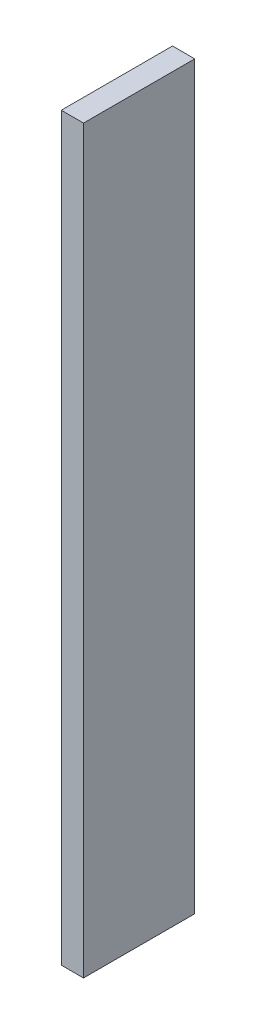
ISO-10303-21;
HEADER;
FILE_DESCRIPTION(('STEP AP214'),'2;1');
FILE_NAME('part.step','',(''),(''),'','','');
FILE_SCHEMA(('AUTOMOTIVE_DESIGN { 1 0 10303 214 1 1 1 1 }'));
ENDSEC;
DATA;
#1=APPLICATION_CONTEXT('core data for automotive mechanical design processes');
#2=APPLICATION_PROTOCOL_DEFINITION('international standard','automotive_design',2000,#1);
#3=PRODUCT_CONTEXT('',#1,'mechanical');
#4=PRODUCT('Part','Part','',(#3));
#5=PRODUCT_RELATED_PRODUCT_CATEGORY('part','',(#4));
#6=PRODUCT_DEFINITION_FORMATION('','',#4);
#7=PRODUCT_DEFINITION_CONTEXT('part definition',#1,'design');
#8=PRODUCT_DEFINITION('design','',#6,#7);
#9=PRODUCT_DEFINITION_SHAPE('','',#8);
#10=(LENGTH_UNIT() NAMED_UNIT(*) SI_UNIT(.MILLI.,.METRE.));
#11=(NAMED_UNIT(*) PLANE_ANGLE_UNIT() SI_UNIT($,.RADIAN.));
#12=(NAMED_UNIT(*) SI_UNIT($,.STERADIAN.) SOLID_ANGLE_UNIT());
#13=UNCERTAINTY_MEASURE_WITH_UNIT(LENGTH_MEASURE(1.E-05),#10,'distance_accuracy_value','');
#14=(GEOMETRIC_REPRESENTATION_CONTEXT(3) GLOBAL_UNCERTAINTY_ASSIGNED_CONTEXT((#13)) GLOBAL_UNIT_ASSIGNED_CONTEXT((#10,
#11,#12)) REPRESENTATION_CONTEXT('',''));
#15=CARTESIAN_POINT('',(0.,0.,0.));
#16=DIRECTION('',(0.,0.,1.));
#17=DIRECTION('',(1.,0.,0.));
#18=AXIS2_PLACEMENT_3D('',#15,#16,#17);
#19=CARTESIAN_POINT('',(68.4980932156586,185.939608660786,0.));
#20=DIRECTION('',(0.,0.,-1.));
#21=DIRECTION('',(1.,0.,0.));
#22=AXIS2_PLACEMENT_3D('',#19,#20,#21);
#23=PLANE('',#22);
#24=DIRECTION('',(0.,1.,0.));
#25=VECTOR('',#24,1.);
#26=CARTESIAN_POINT('',(-41.5019067843414,185.939608660786,0.));
#27=LINE('',#26,#25);
#28=CARTESIAN_POINT('',(-41.5019067843413,-66.8479872866524,0.));
#29=VERTEX_POINT('',#28);
#30=CARTESIAN_POINT('',(-41.5019067843414,265.939608660786,0.));
#31=VERTEX_POINT('',#30);
#32=EDGE_CURVE('E74',#29,#31,#27,.T.);
#33=ORIENTED_EDGE('',*,*,#32,.F.);
#34=DIRECTION('',(-1.,0.,0.));
#35=VECTOR('',#34,1.);
#36=CARTESIAN_POINT('',(-41.5019067843413,-66.8479872866524,0.));
#37=LINE('',#36,#35);
#38=CARTESIAN_POINT('',(-51.5019067843414,-66.8479872866524,0.));
#39=VERTEX_POINT('',#38);
#40=EDGE_CURVE('E99',#29,#39,#37,.T.);
#41=ORIENTED_EDGE('',*,*,#40,.T.);
#42=DIRECTION('',(0.,1.,0.));
#43=VECTOR('',#42,1.);
#44=CARTESIAN_POINT('',(-51.5019067843414,185.939608660786,0.));
#45=LINE('',#44,#43);
#46=CARTESIAN_POINT('',(-51.5019067843414,265.939608660786,0.));
#47=VERTEX_POINT('',#46);
#48=EDGE_CURVE('E92',#39,#47,#45,.T.);
#49=ORIENTED_EDGE('',*,*,#48,.T.);
#50=DIRECTION('',(1.,0.,0.));
#51=VECTOR('',#50,1.);
#52=CARTESIAN_POINT('',(-51.5019067843414,265.939608660786,0.));
#53=LINE('',#52,#51);
#54=EDGE_CURVE('E113',#47,#31,#53,.T.);
#55=ORIENTED_EDGE('',*,*,#54,.T.);
#56=EDGE_LOOP('',(#33,#41,#49,#55));
#57=FACE_BOUND('',#56,.T.);
#58=ADVANCED_FACE('F43',(#57),#23,.T.);
#59=CARTESIAN_POINT('',(-41.5019067843414,185.939608660786,50.));
#60=DIRECTION('',(-1.,0.,0.));
#61=DIRECTION('',(0.,-1.,0.));
#62=AXIS2_PLACEMENT_3D('',#59,#60,#61);
#63=PLANE('',#62);
#64=ORIENTED_EDGE('',*,*,#32,.T.);
#65=DIRECTION('',(0.,0.,-1.));
#66=VECTOR('',#65,1.);
#67=CARTESIAN_POINT('',(-41.5019067843414,265.939608660786,50.));
#68=LINE('',#67,#66);
#69=CARTESIAN_POINT('',(-41.5019067843414,265.939608660786,50.));
#70=VERTEX_POINT('',#69);
#71=EDGE_CURVE('E12',#70,#31,#68,.T.);
#72=ORIENTED_EDGE('',*,*,#71,.F.);
#73=DIRECTION('',(0.,1.,0.));
#74=VECTOR('',#73,1.);
#75=CARTESIAN_POINT('',(-41.5019067843414,185.939608660786,50.));
#76=LINE('',#75,#74);
#77=CARTESIAN_POINT('',(-41.5019067843413,-66.8479872866524,50.));
#78=VERTEX_POINT('',#77);
#79=EDGE_CURVE('E84',#78,#70,#76,.T.);
#80=ORIENTED_EDGE('',*,*,#79,.F.);
#81=DIRECTION('',(0.,0.,-1.));
#82=VECTOR('',#81,1.);
#83=CARTESIAN_POINT('',(-41.5019067843413,-66.8479872866524,50.));
#84=LINE('',#83,#82);
#85=EDGE_CURVE('E87',#78,#29,#84,.T.);
#86=ORIENTED_EDGE('',*,*,#85,.T.);
#87=EDGE_LOOP('',(#64,#72,#80,#86));
#88=FACE_BOUND('',#87,.T.);
#89=ADVANCED_FACE('F86',(#88),#63,.F.);
#90=CARTESIAN_POINT('',(-51.5019067843414,265.939608660786,50.));
#91=DIRECTION('',(0.,1.,0.));
#92=DIRECTION('',(0.,0.,-1.));
#93=AXIS2_PLACEMENT_3D('',#90,#91,#92);
#94=PLANE('',#93);
#95=ORIENTED_EDGE('',*,*,#54,.F.);
#96=DIRECTION('',(0.,0.,-1.));
#97=VECTOR('',#96,1.);
#98=CARTESIAN_POINT('',(-51.5019067843414,265.939608660786,50.));
#99=LINE('',#98,#97);
#100=CARTESIAN_POINT('',(-51.5019067843414,265.939608660786,50.));
#101=VERTEX_POINT('',#100);
#102=EDGE_CURVE('E52',#101,#47,#99,.T.);
#103=ORIENTED_EDGE('',*,*,#102,.F.);
#104=DIRECTION('',(1.,0.,0.));
#105=VECTOR('',#104,1.);
#106=CARTESIAN_POINT('',(-51.5019067843414,265.939608660786,50.));
#107=LINE('',#106,#105);
#108=EDGE_CURVE('E91',#101,#70,#107,.T.);
#109=ORIENTED_EDGE('',*,*,#108,.T.);
#110=ORIENTED_EDGE('',*,*,#71,.T.);
#111=EDGE_LOOP('',(#95,#103,#109,#110));
#112=FACE_BOUND('',#111,.T.);
#113=ADVANCED_FACE('F117',(#112),#94,.T.);
#114=CARTESIAN_POINT('',(-51.5019067843414,-66.8479872866524,50.));
#115=DIRECTION('',(-1.,0.,0.));
#116=DIRECTION('',(0.,0.,1.));
#117=AXIS2_PLACEMENT_3D('',#114,#115,#116);
#118=PLANE('',#117);
#119=ORIENTED_EDGE('',*,*,#48,.F.);
#120=DIRECTION('',(0.,0.,-1.));
#121=VECTOR('',#120,1.);
#122=CARTESIAN_POINT('',(-51.5019067843414,-66.8479872866524,50.));
#123=LINE('',#122,#121);
#124=CARTESIAN_POINT('',(-51.5019067843414,-66.8479872866524,50.));
#125=VERTEX_POINT('',#124);
#126=EDGE_CURVE('E105',#125,#39,#123,.T.);
#127=ORIENTED_EDGE('',*,*,#126,.F.);
#128=DIRECTION('',(0.,1.,0.));
#129=VECTOR('',#128,1.);
#130=CARTESIAN_POINT('',(-51.5019067843414,185.939608660786,50.));
#131=LINE('',#130,#129);
#132=EDGE_CURVE('E103',#125,#101,#131,.T.);
#133=ORIENTED_EDGE('',*,*,#132,.T.);
#134=ORIENTED_EDGE('',*,*,#102,.T.);
#135=EDGE_LOOP('',(#119,#127,#133,#134));
#136=FACE_BOUND('',#135,.T.);
#137=ADVANCED_FACE('F45',(#136),#118,.T.);
#138=CARTESIAN_POINT('',(8.49809321565865,185.939608660786,50.));
#139=DIRECTION('',(0.,0.,1.));
#140=DIRECTION('',(-1.,0.,0.));
#141=AXIS2_PLACEMENT_3D('',#138,#139,#140);
#142=PLANE('',#141);
#143=ORIENTED_EDGE('',*,*,#79,.T.);
#144=ORIENTED_EDGE('',*,*,#108,.F.);
#145=ORIENTED_EDGE('',*,*,#132,.F.);
#146=DIRECTION('',(-1.,0.,0.));
#147=VECTOR('',#146,1.);
#148=CARTESIAN_POINT('',(-41.5019067843413,-66.8479872866524,50.));
#149=LINE('',#148,#147);
#150=EDGE_CURVE('E98',#78,#125,#149,.T.);
#151=ORIENTED_EDGE('',*,*,#150,.F.);
#152=EDGE_LOOP('',(#143,#144,#145,#151));
#153=FACE_BOUND('',#152,.T.);
#154=ADVANCED_FACE('F101',(#153),#142,.T.);
#155=CARTESIAN_POINT('',(-41.5019067843413,-66.8479872866524,50.));
#156=DIRECTION('',(0.,-1.,0.));
#157=DIRECTION('',(0.,0.,-1.));
#158=AXIS2_PLACEMENT_3D('',#155,#156,#157);
#159=PLANE('',#158);
#160=ORIENTED_EDGE('',*,*,#40,.F.);
#161=ORIENTED_EDGE('',*,*,#85,.F.);
#162=ORIENTED_EDGE('',*,*,#150,.T.);
#163=ORIENTED_EDGE('',*,*,#126,.T.);
#164=EDGE_LOOP('',(#160,#161,#162,#163));
#165=FACE_BOUND('',#164,.T.);
#166=ADVANCED_FACE('F96',(#165),#159,.T.);
#167=CLOSED_SHELL('',(#58,#89,#113,#137,#154,#166));
#168=MANIFOLD_SOLID_BREP('B2',#167);
#169=ADVANCED_BREP_SHAPE_REPRESENTATION('',(#18,#168),#14);
#170=SHAPE_DEFINITION_REPRESENTATION(#9,#169);
ENDSEC;
END-ISO-10303-21;
